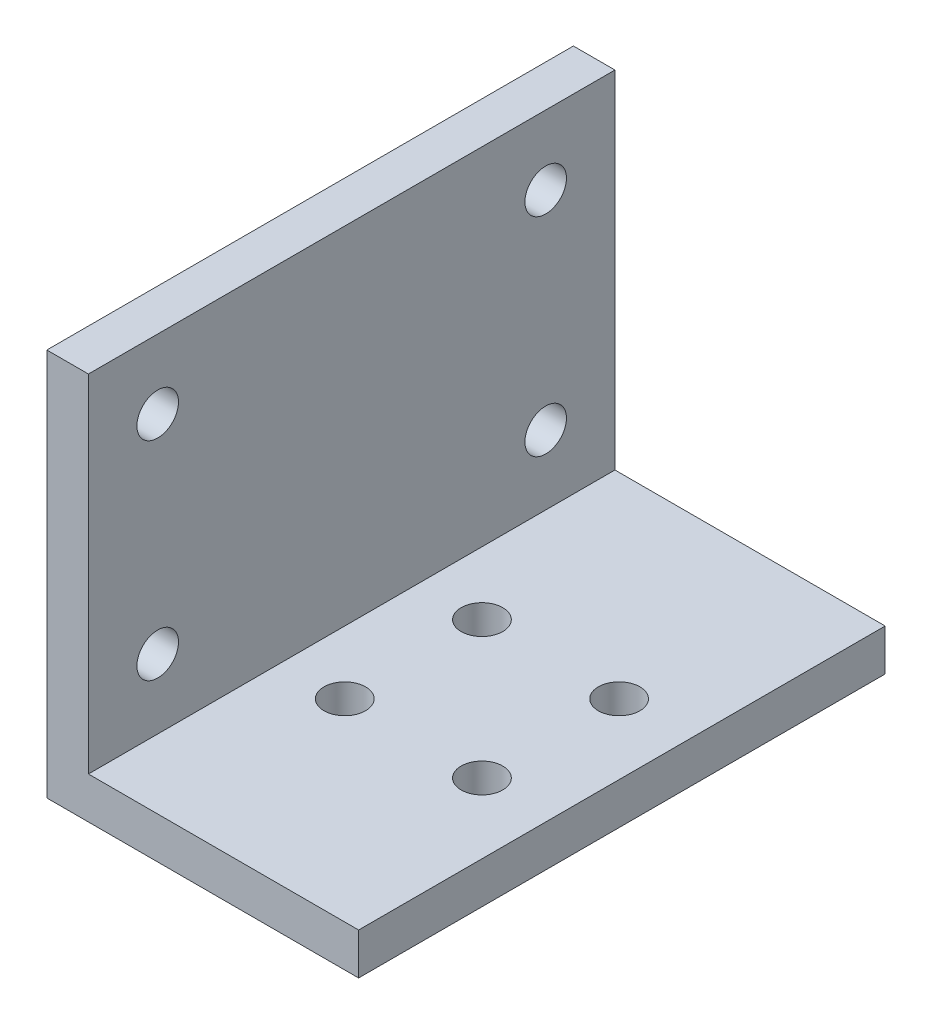
ISO-10303-21;
HEADER;
FILE_DESCRIPTION(('STEP AP214'),'2;1');
FILE_NAME('part.step','',(''),(''),'','','');
FILE_SCHEMA(('AUTOMOTIVE_DESIGN { 1 0 10303 214 1 1 1 1 }'));
ENDSEC;
DATA;
#1=APPLICATION_CONTEXT('core data for automotive mechanical design processes');
#2=APPLICATION_PROTOCOL_DEFINITION('international standard','automotive_design',2000,#1);
#3=PRODUCT_CONTEXT('',#1,'mechanical');
#4=PRODUCT('Part','Part','',(#3));
#5=PRODUCT_RELATED_PRODUCT_CATEGORY('part','',(#4));
#6=PRODUCT_DEFINITION_FORMATION('','',#4);
#7=PRODUCT_DEFINITION_CONTEXT('part definition',#1,'design');
#8=PRODUCT_DEFINITION('design','',#6,#7);
#9=PRODUCT_DEFINITION_SHAPE('','',#8);
#10=(LENGTH_UNIT() NAMED_UNIT(*) SI_UNIT(.MILLI.,.METRE.));
#11=(NAMED_UNIT(*) PLANE_ANGLE_UNIT() SI_UNIT($,.RADIAN.));
#12=(NAMED_UNIT(*) SI_UNIT($,.STERADIAN.) SOLID_ANGLE_UNIT());
#13=UNCERTAINTY_MEASURE_WITH_UNIT(LENGTH_MEASURE(1.E-05),#10,'distance_accuracy_value','');
#14=(GEOMETRIC_REPRESENTATION_CONTEXT(3) GLOBAL_UNCERTAINTY_ASSIGNED_CONTEXT((#13)) GLOBAL_UNIT_ASSIGNED_CONTEXT((#10,
#11,#12)) REPRESENTATION_CONTEXT('',''));
#15=CARTESIAN_POINT('',(0.,0.,0.));
#16=DIRECTION('',(0.,0.,1.));
#17=DIRECTION('',(1.,0.,0.));
#18=AXIS2_PLACEMENT_3D('',#15,#16,#17);
#19=CARTESIAN_POINT('',(-11.25,3.,19.));
#20=DIRECTION('',(1.,0.,0.));
#21=DIRECTION('',(0.,0.,-1.));
#22=AXIS2_PLACEMENT_3D('',#19,#20,#21);
#23=PLANE('',#22);
#24=CARTESIAN_POINT('',(-11.25,8.,-14.));
#25=DIRECTION('',(1.,0.,0.));
#26=DIRECTION('',(0.,0.,-1.));
#27=AXIS2_PLACEMENT_3D('',#24,#25,#26);
#28=CIRCLE('',#27,1.5);
#29=CARTESIAN_POINT('',(-11.25,8.,-15.5));
#30=VERTEX_POINT('',#29);
#31=EDGE_CURVE('E177',#30,#30,#28,.T.);
#32=ORIENTED_EDGE('',*,*,#31,.T.);
#33=EDGE_LOOP('',(#32));
#34=FACE_BOUND('',#33,.T.);
#35=CARTESIAN_POINT('',(-11.25,8.,14.));
#36=DIRECTION('',(1.,0.,0.));
#37=DIRECTION('',(0.,0.,-1.));
#38=AXIS2_PLACEMENT_3D('',#35,#36,#37);
#39=CIRCLE('',#38,1.5);
#40=CARTESIAN_POINT('',(-11.25,8.,12.5));
#41=VERTEX_POINT('',#40);
#42=EDGE_CURVE('E181',#41,#41,#39,.T.);
#43=ORIENTED_EDGE('',*,*,#42,.T.);
#44=EDGE_LOOP('',(#43));
#45=FACE_BOUND('',#44,.T.);
#46=CARTESIAN_POINT('',(-11.25,23.,14.));
#47=DIRECTION('',(1.,0.,0.));
#48=DIRECTION('',(0.,0.,-1.));
#49=AXIS2_PLACEMENT_3D('',#46,#47,#48);
#50=CIRCLE('',#49,1.5);
#51=CARTESIAN_POINT('',(-11.25,23.,12.5));
#52=VERTEX_POINT('',#51);
#53=EDGE_CURVE('E185',#52,#52,#50,.T.);
#54=ORIENTED_EDGE('',*,*,#53,.T.);
#55=EDGE_LOOP('',(#54));
#56=FACE_BOUND('',#55,.T.);
#57=CARTESIAN_POINT('',(-11.25,23.,-14.));
#58=DIRECTION('',(1.,0.,0.));
#59=DIRECTION('',(0.,0.,-1.));
#60=AXIS2_PLACEMENT_3D('',#57,#58,#59);
#61=CIRCLE('',#60,1.5);
#62=CARTESIAN_POINT('',(-11.25,23.,-15.5));
#63=VERTEX_POINT('',#62);
#64=EDGE_CURVE('E188',#63,#63,#61,.T.);
#65=ORIENTED_EDGE('',*,*,#64,.T.);
#66=EDGE_LOOP('',(#65));
#67=FACE_BOUND('',#66,.T.);
#68=DIRECTION('',(0.,0.,1.));
#69=VECTOR('',#68,1.);
#70=CARTESIAN_POINT('',(-11.25,0.,19.));
#71=LINE('',#70,#69);
#72=CARTESIAN_POINT('',(-11.25,0.,-19.));
#73=VERTEX_POINT('',#72);
#74=CARTESIAN_POINT('',(-11.25,0.,19.));
#75=VERTEX_POINT('',#74);
#76=EDGE_CURVE('E100',#73,#75,#71,.T.);
#77=ORIENTED_EDGE('',*,*,#76,.T.);
#78=DIRECTION('',(0.,-1.,0.));
#79=VECTOR('',#78,1.);
#80=CARTESIAN_POINT('',(-11.25,3.,19.));
#81=LINE('',#80,#79);
#82=CARTESIAN_POINT('',(-11.25,28.,19.));
#83=VERTEX_POINT('',#82);
#84=EDGE_CURVE('E11',#83,#75,#81,.T.);
#85=ORIENTED_EDGE('',*,*,#84,.F.);
#86=DIRECTION('',(0.,0.,1.));
#87=VECTOR('',#86,1.);
#88=CARTESIAN_POINT('',(-11.25,28.,-19.));
#89=LINE('',#88,#87);
#90=CARTESIAN_POINT('',(-11.25,28.,-19.));
#91=VERTEX_POINT('',#90);
#92=EDGE_CURVE('E102',#91,#83,#89,.T.);
#93=ORIENTED_EDGE('',*,*,#92,.F.);
#94=DIRECTION('',(0.,-1.,0.));
#95=VECTOR('',#94,1.);
#96=CARTESIAN_POINT('',(-11.25,3.,-19.));
#97=LINE('',#96,#95);
#98=EDGE_CURVE('E86',#91,#73,#97,.T.);
#99=ORIENTED_EDGE('',*,*,#98,.T.);
#100=EDGE_LOOP('',(#77,#85,#93,#99));
#101=FACE_BOUND('',#100,.T.);
#102=ADVANCED_FACE('F42',(#34,#45,#56,#67,#101),#23,.F.);
#103=CARTESIAN_POINT('',(11.25,3.,19.));
#104=DIRECTION('',(0.,0.,-1.));
#105=DIRECTION('',(-1.,0.,0.));
#106=AXIS2_PLACEMENT_3D('',#103,#104,#105);
#107=PLANE('',#106);
#108=DIRECTION('',(1.,0.,0.));
#109=VECTOR('',#108,1.);
#110=CARTESIAN_POINT('',(11.25,0.,19.));
#111=LINE('',#110,#109);
#112=CARTESIAN_POINT('',(11.25,0.,19.));
#113=VERTEX_POINT('',#112);
#114=EDGE_CURVE('E106',#75,#113,#111,.T.);
#115=ORIENTED_EDGE('',*,*,#114,.T.);
#116=DIRECTION('',(0.,-1.,0.));
#117=VECTOR('',#116,1.);
#118=CARTESIAN_POINT('',(11.25,3.,19.));
#119=LINE('',#118,#117);
#120=CARTESIAN_POINT('',(11.25,3.,19.));
#121=VERTEX_POINT('',#120);
#122=EDGE_CURVE('E49',#121,#113,#119,.T.);
#123=ORIENTED_EDGE('',*,*,#122,.F.);
#124=DIRECTION('',(1.,0.,0.));
#125=VECTOR('',#124,1.);
#126=CARTESIAN_POINT('',(11.25,3.,19.));
#127=LINE('',#126,#125);
#128=CARTESIAN_POINT('',(-8.24999999999999,3.,19.));
#129=VERTEX_POINT('',#128);
#130=EDGE_CURVE('E93',#129,#121,#127,.T.);
#131=ORIENTED_EDGE('',*,*,#130,.F.);
#132=DIRECTION('',(0.,-1.,0.));
#133=VECTOR('',#132,1.);
#134=CARTESIAN_POINT('',(-8.25,28.,19.));
#135=LINE('',#134,#133);
#136=CARTESIAN_POINT('',(-8.25,28.,19.));
#137=VERTEX_POINT('',#136);
#138=EDGE_CURVE('E107',#137,#129,#135,.T.);
#139=ORIENTED_EDGE('',*,*,#138,.F.);
#140=DIRECTION('',(1.,0.,0.));
#141=VECTOR('',#140,1.);
#142=CARTESIAN_POINT('',(-11.25,28.,19.));
#143=LINE('',#142,#141);
#144=EDGE_CURVE('E127',#83,#137,#143,.T.);
#145=ORIENTED_EDGE('',*,*,#144,.F.);
#146=ORIENTED_EDGE('',*,*,#84,.T.);
#147=EDGE_LOOP('',(#115,#123,#131,#139,#145,#146));
#148=FACE_BOUND('',#147,.T.);
#149=ADVANCED_FACE('F122',(#148),#107,.F.);
#150=CARTESIAN_POINT('',(11.25,3.,19.));
#151=DIRECTION('',(-1.,0.,0.));
#152=DIRECTION('',(0.,0.,1.));
#153=AXIS2_PLACEMENT_3D('',#150,#151,#152);
#154=PLANE('',#153);
#155=DIRECTION('',(0.,0.,-1.));
#156=VECTOR('',#155,1.);
#157=CARTESIAN_POINT('',(11.25,0.,19.));
#158=LINE('',#157,#156);
#159=CARTESIAN_POINT('',(11.25,0.,-19.));
#160=VERTEX_POINT('',#159);
#161=EDGE_CURVE('E94',#113,#160,#158,.T.);
#162=ORIENTED_EDGE('',*,*,#161,.T.);
#163=DIRECTION('',(0.,-1.,0.));
#164=VECTOR('',#163,1.);
#165=CARTESIAN_POINT('',(11.25,3.,-19.));
#166=LINE('',#165,#164);
#167=CARTESIAN_POINT('',(11.25,3.,-19.));
#168=VERTEX_POINT('',#167);
#169=EDGE_CURVE('E89',#168,#160,#166,.T.);
#170=ORIENTED_EDGE('',*,*,#169,.F.);
#171=DIRECTION('',(0.,0.,-1.));
#172=VECTOR('',#171,1.);
#173=CARTESIAN_POINT('',(11.25,3.,19.));
#174=LINE('',#173,#172);
#175=EDGE_CURVE('E62',#121,#168,#174,.T.);
#176=ORIENTED_EDGE('',*,*,#175,.F.);
#177=ORIENTED_EDGE('',*,*,#122,.T.);
#178=EDGE_LOOP('',(#162,#170,#176,#177));
#179=FACE_BOUND('',#178,.T.);
#180=ADVANCED_FACE('F120',(#179),#154,.F.);
#181=CARTESIAN_POINT('',(11.25,3.,-19.));
#182=DIRECTION('',(0.,0.,1.));
#183=DIRECTION('',(1.,0.,0.));
#184=AXIS2_PLACEMENT_3D('',#181,#182,#183);
#185=PLANE('',#184);
#186=DIRECTION('',(-1.,0.,0.));
#187=VECTOR('',#186,1.);
#188=CARTESIAN_POINT('',(11.25,0.,-19.));
#189=LINE('',#188,#187);
#190=EDGE_CURVE('E82',#160,#73,#189,.T.);
#191=ORIENTED_EDGE('',*,*,#190,.T.);
#192=ORIENTED_EDGE('',*,*,#98,.F.);
#193=DIRECTION('',(-1.,0.,0.));
#194=VECTOR('',#193,1.);
#195=CARTESIAN_POINT('',(-11.25,28.,-19.));
#196=LINE('',#195,#194);
#197=CARTESIAN_POINT('',(-8.25,28.,-19.));
#198=VERTEX_POINT('',#197);
#199=EDGE_CURVE('E141',#198,#91,#196,.T.);
#200=ORIENTED_EDGE('',*,*,#199,.F.);
#201=DIRECTION('',(0.,-1.,0.));
#202=VECTOR('',#201,1.);
#203=CARTESIAN_POINT('',(-8.25,28.,-19.));
#204=LINE('',#203,#202);
#205=CARTESIAN_POINT('',(-8.25,3.,-19.));
#206=VERTEX_POINT('',#205);
#207=EDGE_CURVE('E111',#198,#206,#204,.T.);
#208=ORIENTED_EDGE('',*,*,#207,.T.);
#209=DIRECTION('',(-1.,0.,0.));
#210=VECTOR('',#209,1.);
#211=CARTESIAN_POINT('',(11.25,3.,-19.));
#212=LINE('',#211,#210);
#213=EDGE_CURVE('E103',#168,#206,#212,.T.);
#214=ORIENTED_EDGE('',*,*,#213,.F.);
#215=ORIENTED_EDGE('',*,*,#169,.T.);
#216=EDGE_LOOP('',(#191,#192,#200,#208,#214,#215));
#217=FACE_BOUND('',#216,.T.);
#218=ADVANCED_FACE('F84',(#217),#185,.F.);
#219=CARTESIAN_POINT('',(0.,3.,0.));
#220=DIRECTION('',(0.,1.,0.));
#221=DIRECTION('',(0.,0.,1.));
#222=AXIS2_PLACEMENT_3D('',#219,#220,#221);
#223=PLANE('',#222);
#224=CARTESIAN_POINT('',(6.19974746830599,3.,-4.84974746830601));
#225=DIRECTION('',(0.,1.,0.));
#226=DIRECTION('',(0.,0.,1.));
#227=AXIS2_PLACEMENT_3D('',#224,#225,#226);
#228=CIRCLE('',#227,1.5);
#229=CARTESIAN_POINT('',(6.19974746830599,3.,-3.34974746830601));
#230=VERTEX_POINT('',#229);
#231=EDGE_CURVE('E150',#230,#230,#228,.T.);
#232=ORIENTED_EDGE('',*,*,#231,.F.);
#233=EDGE_LOOP('',(#232));
#234=FACE_BOUND('',#233,.T.);
#235=CARTESIAN_POINT('',(-3.69974746830601,3.,-4.84974746830601));
#236=DIRECTION('',(0.,1.,0.));
#237=DIRECTION('',(0.,0.,1.));
#238=AXIS2_PLACEMENT_3D('',#235,#236,#237);
#239=CIRCLE('',#238,1.5);
#240=CARTESIAN_POINT('',(-3.69974746830601,3.,-3.34974746830601));
#241=VERTEX_POINT('',#240);
#242=EDGE_CURVE('E218',#241,#241,#239,.T.);
#243=ORIENTED_EDGE('',*,*,#242,.F.);
#244=EDGE_LOOP('',(#243));
#245=FACE_BOUND('',#244,.T.);
#246=CARTESIAN_POINT('',(-3.69974746830601,3.,5.04974746830599));
#247=DIRECTION('',(0.,1.,0.));
#248=DIRECTION('',(0.,0.,1.));
#249=AXIS2_PLACEMENT_3D('',#246,#247,#248);
#250=CIRCLE('',#249,1.5);
#251=CARTESIAN_POINT('',(-3.69974746830601,3.,6.54974746830599));
#252=VERTEX_POINT('',#251);
#253=EDGE_CURVE('E215',#252,#252,#250,.T.);
#254=ORIENTED_EDGE('',*,*,#253,.F.);
#255=EDGE_LOOP('',(#254));
#256=FACE_BOUND('',#255,.T.);
#257=CARTESIAN_POINT('',(6.19974746830599,3.,5.04974746830599));
#258=DIRECTION('',(0.,1.,0.));
#259=DIRECTION('',(0.,0.,1.));
#260=AXIS2_PLACEMENT_3D('',#257,#258,#259);
#261=CIRCLE('',#260,1.5);
#262=CARTESIAN_POINT('',(6.19974746830599,3.,6.54974746830599));
#263=VERTEX_POINT('',#262);
#264=EDGE_CURVE('E212',#263,#263,#261,.T.);
#265=ORIENTED_EDGE('',*,*,#264,.F.);
#266=EDGE_LOOP('',(#265));
#267=FACE_BOUND('',#266,.T.);
#268=DIRECTION('',(0.,0.,-1.));
#269=VECTOR('',#268,1.);
#270=CARTESIAN_POINT('',(-8.25,3.,-19.));
#271=LINE('',#270,#269);
#272=EDGE_CURVE('E56',#129,#206,#271,.T.);
#273=ORIENTED_EDGE('',*,*,#272,.F.);
#274=ORIENTED_EDGE('',*,*,#130,.T.);
#275=ORIENTED_EDGE('',*,*,#175,.T.);
#276=ORIENTED_EDGE('',*,*,#213,.T.);
#277=EDGE_LOOP('',(#273,#274,#275,#276));
#278=FACE_BOUND('',#277,.T.);
#279=ADVANCED_FACE('F152',(#234,#245,#256,#267,#278),#223,.T.);
#280=CARTESIAN_POINT('',(0.,0.,0.));
#281=DIRECTION('',(0.,1.,0.));
#282=DIRECTION('',(0.,0.,1.));
#283=AXIS2_PLACEMENT_3D('',#280,#281,#282);
#284=PLANE('',#283);
#285=CARTESIAN_POINT('',(6.19974746830599,0.,-4.84974746830601));
#286=DIRECTION('',(0.,-1.,0.));
#287=DIRECTION('',(0.,0.,-1.));
#288=AXIS2_PLACEMENT_3D('',#285,#286,#287);
#289=CIRCLE('',#288,1.5);
#290=CARTESIAN_POINT('',(6.19974746830599,0.,-6.34974746830601));
#291=VERTEX_POINT('',#290);
#292=EDGE_CURVE('E200',#291,#291,#289,.T.);
#293=ORIENTED_EDGE('',*,*,#292,.F.);
#294=EDGE_LOOP('',(#293));
#295=FACE_BOUND('',#294,.T.);
#296=CARTESIAN_POINT('',(-3.69974746830601,0.,-4.84974746830601));
#297=DIRECTION('',(0.,-1.,0.));
#298=DIRECTION('',(0.,0.,-1.));
#299=AXIS2_PLACEMENT_3D('',#296,#297,#298);
#300=CIRCLE('',#299,1.5);
#301=CARTESIAN_POINT('',(-3.69974746830601,0.,-6.34974746830601));
#302=VERTEX_POINT('',#301);
#303=EDGE_CURVE('E205',#302,#302,#300,.T.);
#304=ORIENTED_EDGE('',*,*,#303,.F.);
#305=EDGE_LOOP('',(#304));
#306=FACE_BOUND('',#305,.T.);
#307=CARTESIAN_POINT('',(-3.69974746830601,0.,5.04974746830599));
#308=DIRECTION('',(0.,-1.,0.));
#309=DIRECTION('',(0.,0.,-1.));
#310=AXIS2_PLACEMENT_3D('',#307,#308,#309);
#311=CIRCLE('',#310,1.5);
#312=CARTESIAN_POINT('',(-3.69974746830601,0.,3.54974746830599));
#313=VERTEX_POINT('',#312);
#314=EDGE_CURVE('E201',#313,#313,#311,.T.);
#315=ORIENTED_EDGE('',*,*,#314,.F.);
#316=EDGE_LOOP('',(#315));
#317=FACE_BOUND('',#316,.T.);
#318=CARTESIAN_POINT('',(6.19974746830599,0.,5.04974746830599));
#319=DIRECTION('',(0.,-1.,0.));
#320=DIRECTION('',(0.,0.,-1.));
#321=AXIS2_PLACEMENT_3D('',#318,#319,#320);
#322=CIRCLE('',#321,1.5);
#323=CARTESIAN_POINT('',(6.19974746830599,0.,3.54974746830599));
#324=VERTEX_POINT('',#323);
#325=EDGE_CURVE('E204',#324,#324,#322,.T.);
#326=ORIENTED_EDGE('',*,*,#325,.F.);
#327=EDGE_LOOP('',(#326));
#328=FACE_BOUND('',#327,.T.);
#329=ORIENTED_EDGE('',*,*,#76,.F.);
#330=ORIENTED_EDGE('',*,*,#190,.F.);
#331=ORIENTED_EDGE('',*,*,#161,.F.);
#332=ORIENTED_EDGE('',*,*,#114,.F.);
#333=EDGE_LOOP('',(#329,#330,#331,#332));
#334=FACE_BOUND('',#333,.T.);
#335=ADVANCED_FACE('F105',(#295,#306,#317,#328,#334),#284,.F.);
#336=CARTESIAN_POINT('',(-8.25,28.,-19.));
#337=DIRECTION('',(-1.,0.,0.));
#338=DIRECTION('',(0.,0.,1.));
#339=AXIS2_PLACEMENT_3D('',#336,#337,#338);
#340=PLANE('',#339);
#341=CARTESIAN_POINT('',(-8.25,8.,-14.));
#342=DIRECTION('',(1.,0.,0.));
#343=DIRECTION('',(0.,0.,-1.));
#344=AXIS2_PLACEMENT_3D('',#341,#342,#343);
#345=CIRCLE('',#344,1.5);
#346=CARTESIAN_POINT('',(-8.25,8.,-15.5));
#347=VERTEX_POINT('',#346);
#348=EDGE_CURVE('E258',#347,#347,#345,.T.);
#349=ORIENTED_EDGE('',*,*,#348,.F.);
#350=EDGE_LOOP('',(#349));
#351=FACE_BOUND('',#350,.T.);
#352=CARTESIAN_POINT('',(-8.25,8.,14.));
#353=DIRECTION('',(1.,0.,0.));
#354=DIRECTION('',(0.,0.,-1.));
#355=AXIS2_PLACEMENT_3D('',#352,#353,#354);
#356=CIRCLE('',#355,1.5);
#357=CARTESIAN_POINT('',(-8.25,8.,12.5));
#358=VERTEX_POINT('',#357);
#359=EDGE_CURVE('E262',#358,#358,#356,.T.);
#360=ORIENTED_EDGE('',*,*,#359,.F.);
#361=EDGE_LOOP('',(#360));
#362=FACE_BOUND('',#361,.T.);
#363=CARTESIAN_POINT('',(-8.25,23.,14.));
#364=DIRECTION('',(1.,0.,0.));
#365=DIRECTION('',(0.,0.,-1.));
#366=AXIS2_PLACEMENT_3D('',#363,#364,#365);
#367=CIRCLE('',#366,1.5);
#368=CARTESIAN_POINT('',(-8.25,23.,12.5));
#369=VERTEX_POINT('',#368);
#370=EDGE_CURVE('E194',#369,#369,#367,.T.);
#371=ORIENTED_EDGE('',*,*,#370,.F.);
#372=EDGE_LOOP('',(#371));
#373=FACE_BOUND('',#372,.T.);
#374=CARTESIAN_POINT('',(-8.25,23.,-14.));
#375=DIRECTION('',(1.,0.,0.));
#376=DIRECTION('',(0.,0.,-1.));
#377=AXIS2_PLACEMENT_3D('',#374,#375,#376);
#378=CIRCLE('',#377,1.5);
#379=CARTESIAN_POINT('',(-8.25,23.,-15.5));
#380=VERTEX_POINT('',#379);
#381=EDGE_CURVE('E190',#380,#380,#378,.T.);
#382=ORIENTED_EDGE('',*,*,#381,.F.);
#383=EDGE_LOOP('',(#382));
#384=FACE_BOUND('',#383,.T.);
#385=ORIENTED_EDGE('',*,*,#272,.T.);
#386=ORIENTED_EDGE('',*,*,#207,.F.);
#387=DIRECTION('',(0.,0.,-1.));
#388=VECTOR('',#387,1.);
#389=CARTESIAN_POINT('',(-8.25,28.,-19.));
#390=LINE('',#389,#388);
#391=EDGE_CURVE('E138',#137,#198,#390,.T.);
#392=ORIENTED_EDGE('',*,*,#391,.F.);
#393=ORIENTED_EDGE('',*,*,#138,.T.);
#394=EDGE_LOOP('',(#385,#386,#392,#393));
#395=FACE_BOUND('',#394,.T.);
#396=ADVANCED_FACE('F145',(#351,#362,#373,#384,#395),#340,.F.);
#397=CARTESIAN_POINT('',(0.,28.,0.));
#398=DIRECTION('',(0.,1.,0.));
#399=DIRECTION('',(0.,0.,1.));
#400=AXIS2_PLACEMENT_3D('',#397,#398,#399);
#401=PLANE('',#400);
#402=ORIENTED_EDGE('',*,*,#92,.T.);
#403=ORIENTED_EDGE('',*,*,#144,.T.);
#404=ORIENTED_EDGE('',*,*,#391,.T.);
#405=ORIENTED_EDGE('',*,*,#199,.T.);
#406=EDGE_LOOP('',(#402,#403,#404,#405));
#407=FACE_BOUND('',#406,.T.);
#408=ADVANCED_FACE('F140',(#407),#401,.T.);
#409=CARTESIAN_POINT('',(6.19974746830599,25.,5.04974746830599));
#410=DIRECTION('',(0.,-1.,0.));
#411=DIRECTION('',(0.,0.,-1.));
#412=AXIS2_PLACEMENT_3D('',#409,#410,#411);
#413=CYLINDRICAL_SURFACE('',#412,1.5);
#414=ORIENTED_EDGE('',*,*,#264,.T.);
#415=EDGE_LOOP('',(#414));
#416=FACE_BOUND('',#415,.T.);
#417=ORIENTED_EDGE('',*,*,#325,.T.);
#418=EDGE_LOOP('',(#417));
#419=FACE_BOUND('',#418,.T.);
#420=ADVANCED_FACE('F238',(#416,#419),#413,.F.);
#421=CARTESIAN_POINT('',(-3.69974746830601,25.,5.04974746830599));
#422=DIRECTION('',(0.,-1.,0.));
#423=DIRECTION('',(0.,0.,-1.));
#424=AXIS2_PLACEMENT_3D('',#421,#422,#423);
#425=CYLINDRICAL_SURFACE('',#424,1.5);
#426=ORIENTED_EDGE('',*,*,#253,.T.);
#427=EDGE_LOOP('',(#426));
#428=FACE_BOUND('',#427,.T.);
#429=ORIENTED_EDGE('',*,*,#314,.T.);
#430=EDGE_LOOP('',(#429));
#431=FACE_BOUND('',#430,.T.);
#432=ADVANCED_FACE('F240',(#428,#431),#425,.F.);
#433=CARTESIAN_POINT('',(-3.69974746830601,25.,-4.84974746830601));
#434=DIRECTION('',(0.,-1.,0.));
#435=DIRECTION('',(0.,0.,-1.));
#436=AXIS2_PLACEMENT_3D('',#433,#434,#435);
#437=CYLINDRICAL_SURFACE('',#436,1.5);
#438=ORIENTED_EDGE('',*,*,#242,.T.);
#439=EDGE_LOOP('',(#438));
#440=FACE_BOUND('',#439,.T.);
#441=ORIENTED_EDGE('',*,*,#303,.T.);
#442=EDGE_LOOP('',(#441));
#443=FACE_BOUND('',#442,.T.);
#444=ADVANCED_FACE('F228',(#440,#443),#437,.F.);
#445=CARTESIAN_POINT('',(6.19974746830599,25.,-4.84974746830601));
#446=DIRECTION('',(0.,-1.,0.));
#447=DIRECTION('',(0.,0.,-1.));
#448=AXIS2_PLACEMENT_3D('',#445,#446,#447);
#449=CYLINDRICAL_SURFACE('',#448,1.5);
#450=ORIENTED_EDGE('',*,*,#231,.T.);
#451=EDGE_LOOP('',(#450));
#452=FACE_BOUND('',#451,.T.);
#453=ORIENTED_EDGE('',*,*,#292,.T.);
#454=EDGE_LOOP('',(#453));
#455=FACE_BOUND('',#454,.T.);
#456=ADVANCED_FACE('F224',(#452,#455),#449,.F.);
#457=CARTESIAN_POINT('',(-33.25,23.,-14.));
#458=DIRECTION('',(1.,0.,0.));
#459=DIRECTION('',(0.,0.,-1.));
#460=AXIS2_PLACEMENT_3D('',#457,#458,#459);
#461=CYLINDRICAL_SURFACE('',#460,1.5);
#462=ORIENTED_EDGE('',*,*,#381,.T.);
#463=EDGE_LOOP('',(#462));
#464=FACE_BOUND('',#463,.T.);
#465=ORIENTED_EDGE('',*,*,#64,.F.);
#466=EDGE_LOOP('',(#465));
#467=FACE_BOUND('',#466,.T.);
#468=ADVANCED_FACE('F227',(#464,#467),#461,.F.);
#469=CARTESIAN_POINT('',(-33.25,23.,14.));
#470=DIRECTION('',(1.,0.,0.));
#471=DIRECTION('',(0.,0.,-1.));
#472=AXIS2_PLACEMENT_3D('',#469,#470,#471);
#473=CYLINDRICAL_SURFACE('',#472,1.5);
#474=ORIENTED_EDGE('',*,*,#370,.T.);
#475=EDGE_LOOP('',(#474));
#476=FACE_BOUND('',#475,.T.);
#477=ORIENTED_EDGE('',*,*,#53,.F.);
#478=EDGE_LOOP('',(#477));
#479=FACE_BOUND('',#478,.T.);
#480=ADVANCED_FACE('F269',(#476,#479),#473,.F.);
#481=CARTESIAN_POINT('',(-33.25,8.,14.));
#482=DIRECTION('',(1.,0.,0.));
#483=DIRECTION('',(0.,0.,-1.));
#484=AXIS2_PLACEMENT_3D('',#481,#482,#483);
#485=CYLINDRICAL_SURFACE('',#484,1.5);
#486=ORIENTED_EDGE('',*,*,#359,.T.);
#487=EDGE_LOOP('',(#486));
#488=FACE_BOUND('',#487,.T.);
#489=ORIENTED_EDGE('',*,*,#42,.F.);
#490=EDGE_LOOP('',(#489));
#491=FACE_BOUND('',#490,.T.);
#492=ADVANCED_FACE('F273',(#488,#491),#485,.F.);
#493=CARTESIAN_POINT('',(-33.25,8.,-14.));
#494=DIRECTION('',(1.,0.,0.));
#495=DIRECTION('',(0.,0.,-1.));
#496=AXIS2_PLACEMENT_3D('',#493,#494,#495);
#497=CYLINDRICAL_SURFACE('',#496,1.5);
#498=ORIENTED_EDGE('',*,*,#348,.T.);
#499=EDGE_LOOP('',(#498));
#500=FACE_BOUND('',#499,.T.);
#501=ORIENTED_EDGE('',*,*,#31,.F.);
#502=EDGE_LOOP('',(#501));
#503=FACE_BOUND('',#502,.T.);
#504=ADVANCED_FACE('F277',(#500,#503),#497,.F.);
#505=CLOSED_SHELL('',(#102,#149,#180,#218,#279,#335,#396,#408,#420,#432,#444,#456,#468,#480,
#492,#504));
#506=MANIFOLD_SOLID_BREP('B2',#505);
#507=ADVANCED_BREP_SHAPE_REPRESENTATION('',(#18,#506),#14);
#508=SHAPE_DEFINITION_REPRESENTATION(#9,#507);
ENDSEC;
END-ISO-10303-21;
